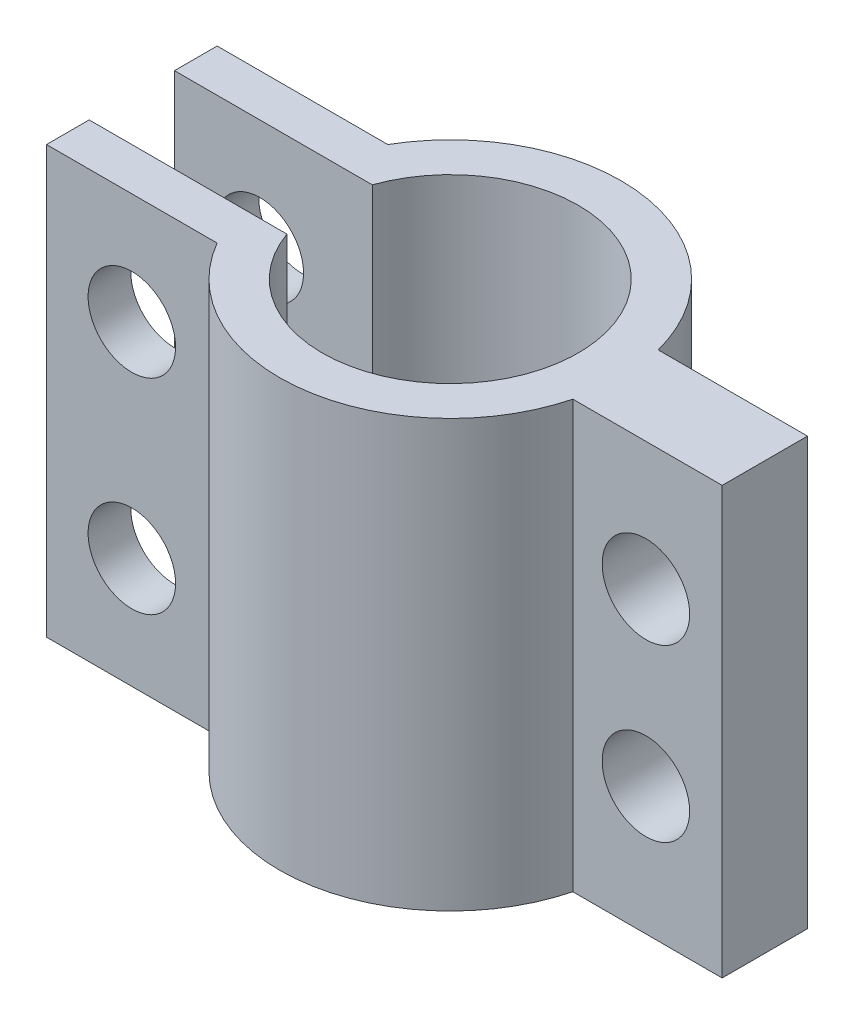
ISO-10303-21;
HEADER;
FILE_DESCRIPTION(('STEP AP214'),'2;1');
FILE_NAME('part.step','',(''),(''),'','','');
FILE_SCHEMA(('AUTOMOTIVE_DESIGN { 1 0 10303 214 1 1 1 1 }'));
ENDSEC;
DATA;
#1=APPLICATION_CONTEXT('core data for automotive mechanical design processes');
#2=APPLICATION_PROTOCOL_DEFINITION('international standard','automotive_design',2000,#1);
#3=PRODUCT_CONTEXT('',#1,'mechanical');
#4=PRODUCT('Part','Part','',(#3));
#5=PRODUCT_RELATED_PRODUCT_CATEGORY('part','',(#4));
#6=PRODUCT_DEFINITION_FORMATION('','',#4);
#7=PRODUCT_DEFINITION_CONTEXT('part definition',#1,'design');
#8=PRODUCT_DEFINITION('design','',#6,#7);
#9=PRODUCT_DEFINITION_SHAPE('','',#8);
#10=(LENGTH_UNIT() NAMED_UNIT(*) SI_UNIT(.MILLI.,.METRE.));
#11=(NAMED_UNIT(*) PLANE_ANGLE_UNIT() SI_UNIT($,.RADIAN.));
#12=(NAMED_UNIT(*) SI_UNIT($,.STERADIAN.) SOLID_ANGLE_UNIT());
#13=UNCERTAINTY_MEASURE_WITH_UNIT(LENGTH_MEASURE(1.E-05),#10,'distance_accuracy_value','');
#14=(GEOMETRIC_REPRESENTATION_CONTEXT(3) GLOBAL_UNCERTAINTY_ASSIGNED_CONTEXT((#13)) GLOBAL_UNIT_ASSIGNED_CONTEXT((#10,
#11,#12)) REPRESENTATION_CONTEXT('',''));
#15=CARTESIAN_POINT('',(0.,0.,0.));
#16=DIRECTION('',(0.,0.,1.));
#17=DIRECTION('',(1.,0.,0.));
#18=AXIS2_PLACEMENT_3D('',#15,#16,#17);
#19=CARTESIAN_POINT('',(0.,20.,-2.));
#20=DIRECTION('',(0.,0.,-1.));
#21=DIRECTION('',(-1.,0.,0.));
#22=AXIS2_PLACEMENT_3D('',#19,#20,#21);
#23=PLANE('',#22);
#24=CARTESIAN_POINT('',(11.1706582066653,14.,-2.));
#25=DIRECTION('',(0.,0.,-1.));
#26=DIRECTION('',(-1.,0.,0.));
#27=AXIS2_PLACEMENT_3D('',#24,#25,#26);
#28=CIRCLE('',#27,2.05);
#29=CARTESIAN_POINT('',(9.12065820666526,14.,-2.));
#30=VERTEX_POINT('',#29);
#31=EDGE_CURVE('E185',#30,#30,#28,.T.);
#32=ORIENTED_EDGE('',*,*,#31,.F.);
#33=EDGE_LOOP('',(#32));
#34=FACE_BOUND('',#33,.T.);
#35=CARTESIAN_POINT('',(11.1706582066653,6.,-2.));
#36=DIRECTION('',(0.,0.,-1.));
#37=DIRECTION('',(-1.,0.,0.));
#38=AXIS2_PLACEMENT_3D('',#35,#36,#37);
#39=CIRCLE('',#38,2.05);
#40=CARTESIAN_POINT('',(9.12065820666526,6.,-2.));
#41=VERTEX_POINT('',#40);
#42=EDGE_CURVE('E226',#41,#41,#39,.T.);
#43=ORIENTED_EDGE('',*,*,#42,.F.);
#44=EDGE_LOOP('',(#43));
#45=FACE_BOUND('',#44,.T.);
#46=DIRECTION('',(1.,0.,0.));
#47=VECTOR('',#46,1.);
#48=CARTESIAN_POINT('',(0.,0.,-2.));
#49=LINE('',#48,#47);
#50=CARTESIAN_POINT('',(7.74596669241483,0.,-2.));
#51=VERTEX_POINT('',#50);
#52=CARTESIAN_POINT('',(14.7459666924148,0.,-2.));
#53=VERTEX_POINT('',#52);
#54=EDGE_CURVE('E176',#51,#53,#49,.T.);
#55=ORIENTED_EDGE('',*,*,#54,.F.);
#56=DIRECTION('',(0.,-1.,0.));
#57=VECTOR('',#56,1.);
#58=CARTESIAN_POINT('',(7.74596669241483,20.,-2.));
#59=LINE('',#58,#57);
#60=CARTESIAN_POINT('',(7.74596669241483,20.,-2.));
#61=VERTEX_POINT('',#60);
#62=EDGE_CURVE('E12',#61,#51,#59,.T.);
#63=ORIENTED_EDGE('',*,*,#62,.F.);
#64=DIRECTION('',(1.,0.,0.));
#65=VECTOR('',#64,1.);
#66=CARTESIAN_POINT('',(0.,20.,-2.));
#67=LINE('',#66,#65);
#68=CARTESIAN_POINT('',(14.7459666924148,20.,-2.));
#69=VERTEX_POINT('',#68);
#70=EDGE_CURVE('E242',#61,#69,#67,.T.);
#71=ORIENTED_EDGE('',*,*,#70,.T.);
#72=DIRECTION('',(0.,-1.,0.));
#73=VECTOR('',#72,1.);
#74=CARTESIAN_POINT('',(14.7459666924148,20.,-2.));
#75=LINE('',#74,#73);
#76=EDGE_CURVE('E96',#69,#53,#75,.T.);
#77=ORIENTED_EDGE('',*,*,#76,.T.);
#78=EDGE_LOOP('',(#55,#63,#71,#77));
#79=FACE_BOUND('',#78,.T.);
#80=ADVANCED_FACE('F77',(#34,#45,#79),#23,.T.);
#81=CARTESIAN_POINT('',(0.,20.,2.));
#82=DIRECTION('',(0.,0.,1.));
#83=DIRECTION('',(1.,0.,0.));
#84=AXIS2_PLACEMENT_3D('',#81,#82,#83);
#85=PLANE('',#84);
#86=CARTESIAN_POINT('',(11.1706582066653,14.,2.));
#87=DIRECTION('',(0.,0.,1.));
#88=DIRECTION('',(1.,0.,0.));
#89=AXIS2_PLACEMENT_3D('',#86,#87,#88);
#90=CIRCLE('',#89,2.05);
#91=CARTESIAN_POINT('',(13.2206582066653,14.,2.));
#92=VERTEX_POINT('',#91);
#93=EDGE_CURVE('E81',#92,#92,#90,.T.);
#94=ORIENTED_EDGE('',*,*,#93,.F.);
#95=EDGE_LOOP('',(#94));
#96=FACE_BOUND('',#95,.T.);
#97=CARTESIAN_POINT('',(11.1706582066653,6.,2.));
#98=DIRECTION('',(0.,0.,1.));
#99=DIRECTION('',(1.,0.,0.));
#100=AXIS2_PLACEMENT_3D('',#97,#98,#99);
#101=CIRCLE('',#100,2.05);
#102=CARTESIAN_POINT('',(13.2206582066653,6.,2.));
#103=VERTEX_POINT('',#102);
#104=EDGE_CURVE('E224',#103,#103,#101,.T.);
#105=ORIENTED_EDGE('',*,*,#104,.F.);
#106=EDGE_LOOP('',(#105));
#107=FACE_BOUND('',#106,.T.);
#108=DIRECTION('',(-1.,0.,0.));
#109=VECTOR('',#108,1.);
#110=CARTESIAN_POINT('',(0.,0.,2.));
#111=LINE('',#110,#109);
#112=CARTESIAN_POINT('',(14.7459666924148,0.,2.));
#113=VERTEX_POINT('',#112);
#114=CARTESIAN_POINT('',(7.74596669241483,0.,2.));
#115=VERTEX_POINT('',#114);
#116=EDGE_CURVE('E251',#113,#115,#111,.T.);
#117=ORIENTED_EDGE('',*,*,#116,.F.);
#118=DIRECTION('',(0.,-1.,0.));
#119=VECTOR('',#118,1.);
#120=CARTESIAN_POINT('',(14.7459666924148,20.,2.));
#121=LINE('',#120,#119);
#122=CARTESIAN_POINT('',(14.7459666924148,20.,2.));
#123=VERTEX_POINT('',#122);
#124=EDGE_CURVE('E257',#123,#113,#121,.T.);
#125=ORIENTED_EDGE('',*,*,#124,.F.);
#126=DIRECTION('',(-1.,0.,0.));
#127=VECTOR('',#126,1.);
#128=CARTESIAN_POINT('',(0.,20.,2.));
#129=LINE('',#128,#127);
#130=CARTESIAN_POINT('',(7.74596669241483,20.,2.));
#131=VERTEX_POINT('',#130);
#132=EDGE_CURVE('E244',#123,#131,#129,.T.);
#133=ORIENTED_EDGE('',*,*,#132,.T.);
#134=DIRECTION('',(0.,-1.,0.));
#135=VECTOR('',#134,1.);
#136=CARTESIAN_POINT('',(7.74596669241483,20.,2.));
#137=LINE('',#136,#135);
#138=EDGE_CURVE('E87',#131,#115,#137,.T.);
#139=ORIENTED_EDGE('',*,*,#138,.T.);
#140=EDGE_LOOP('',(#117,#125,#133,#139));
#141=FACE_BOUND('',#140,.T.);
#142=ADVANCED_FACE('F387',(#96,#107,#141),#85,.T.);
#143=CARTESIAN_POINT('',(14.7459666924148,20.,0.));
#144=DIRECTION('',(1.,0.,0.));
#145=DIRECTION('',(0.,0.,-1.));
#146=AXIS2_PLACEMENT_3D('',#143,#144,#145);
#147=PLANE('',#146);
#148=DIRECTION('',(0.,0.,1.));
#149=VECTOR('',#148,1.);
#150=CARTESIAN_POINT('',(14.7459666924148,0.,0.));
#151=LINE('',#150,#149);
#152=EDGE_CURVE('E245',#53,#113,#151,.T.);
#153=ORIENTED_EDGE('',*,*,#152,.F.);
#154=ORIENTED_EDGE('',*,*,#76,.F.);
#155=DIRECTION('',(0.,0.,1.));
#156=VECTOR('',#155,1.);
#157=CARTESIAN_POINT('',(14.7459666924148,20.,0.));
#158=LINE('',#157,#156);
#159=EDGE_CURVE('E248',#69,#123,#158,.T.);
#160=ORIENTED_EDGE('',*,*,#159,.T.);
#161=ORIENTED_EDGE('',*,*,#124,.T.);
#162=EDGE_LOOP('',(#153,#154,#160,#161));
#163=FACE_BOUND('',#162,.T.);
#164=ADVANCED_FACE('F383',(#163),#147,.T.);
#165=CARTESIAN_POINT('',(0.,20.,0.));
#166=DIRECTION('',(0.,1.,0.));
#167=DIRECTION('',(0.,0.,1.));
#168=AXIS2_PLACEMENT_3D('',#165,#166,#167);
#169=PLANE('',#168);
#170=ORIENTED_EDGE('',*,*,#70,.F.);
#171=CARTESIAN_POINT('',(0.,20.,0.));
#172=DIRECTION('',(0.,-1.,0.));
#173=DIRECTION('',(0.,0.,-1.));
#174=AXIS2_PLACEMENT_3D('',#171,#172,#173);
#175=CIRCLE('',#174,8.);
#176=CARTESIAN_POINT('',(-6.92820323027551,20.,-4.));
#177=VERTEX_POINT('',#176);
#178=EDGE_CURVE('E260',#177,#61,#175,.T.);
#179=ORIENTED_EDGE('',*,*,#178,.F.);
#180=DIRECTION('',(1.,0.,0.));
#181=VECTOR('',#180,1.);
#182=CARTESIAN_POINT('',(-14.9282032302755,20.,-4.));
#183=LINE('',#182,#181);
#184=CARTESIAN_POINT('',(-14.9282032302755,20.,-4.));
#185=VERTEX_POINT('',#184);
#186=EDGE_CURVE('E191',#185,#177,#183,.T.);
#187=ORIENTED_EDGE('',*,*,#186,.F.);
#188=DIRECTION('',(0.,0.,-1.));
#189=VECTOR('',#188,1.);
#190=CARTESIAN_POINT('',(-14.9282032302755,20.,-2.));
#191=LINE('',#190,#189);
#192=CARTESIAN_POINT('',(-14.9282032302755,20.,-2.));
#193=VERTEX_POINT('',#192);
#194=EDGE_CURVE('E172',#193,#185,#191,.T.);
#195=ORIENTED_EDGE('',*,*,#194,.F.);
#196=DIRECTION('',(-1.,0.,0.));
#197=VECTOR('',#196,1.);
#198=CARTESIAN_POINT('',(-5.65685424949238,20.,-2.));
#199=LINE('',#198,#197);
#200=CARTESIAN_POINT('',(-5.65685424949238,20.,-2.));
#201=VERTEX_POINT('',#200);
#202=EDGE_CURVE('E272',#201,#193,#199,.T.);
#203=ORIENTED_EDGE('',*,*,#202,.F.);
#204=CARTESIAN_POINT('',(0.,20.,0.));
#205=DIRECTION('',(0.,-1.,0.));
#206=DIRECTION('',(0.,0.,-1.));
#207=AXIS2_PLACEMENT_3D('',#204,#205,#206);
#208=CIRCLE('',#207,6.);
#209=CARTESIAN_POINT('',(-5.65685424949238,20.,2.));
#210=VERTEX_POINT('',#209);
#211=EDGE_CURVE('E270',#201,#210,#208,.T.);
#212=ORIENTED_EDGE('',*,*,#211,.T.);
#213=DIRECTION('',(-1.,0.,0.));
#214=VECTOR('',#213,1.);
#215=CARTESIAN_POINT('',(-5.65685424949238,20.,2.));
#216=LINE('',#215,#214);
#217=CARTESIAN_POINT('',(-14.9282032302755,20.,2.));
#218=VERTEX_POINT('',#217);
#219=EDGE_CURVE('E268',#210,#218,#216,.T.);
#220=ORIENTED_EDGE('',*,*,#219,.T.);
#221=DIRECTION('',(0.,0.,1.));
#222=VECTOR('',#221,1.);
#223=CARTESIAN_POINT('',(-14.9282032302755,20.,2.));
#224=LINE('',#223,#222);
#225=CARTESIAN_POINT('',(-14.9282032302755,20.,4.));
#226=VERTEX_POINT('',#225);
#227=EDGE_CURVE('E266',#218,#226,#224,.T.);
#228=ORIENTED_EDGE('',*,*,#227,.T.);
#229=DIRECTION('',(1.,0.,0.));
#230=VECTOR('',#229,1.);
#231=CARTESIAN_POINT('',(-14.9282032302755,20.,4.));
#232=LINE('',#231,#230);
#233=CARTESIAN_POINT('',(-6.9282032302755,20.,4.00000000000001));
#234=VERTEX_POINT('',#233);
#235=EDGE_CURVE('E263',#226,#234,#232,.T.);
#236=ORIENTED_EDGE('',*,*,#235,.T.);
#237=EDGE_CURVE('E193',#131,#234,#175,.T.);
#238=ORIENTED_EDGE('',*,*,#237,.F.);
#239=ORIENTED_EDGE('',*,*,#132,.F.);
#240=ORIENTED_EDGE('',*,*,#159,.F.);
#241=EDGE_LOOP('',(#170,#179,#187,#195,#203,#212,#220,#228,#236,#238,#239,#240));
#242=FACE_BOUND('',#241,.T.);
#243=ADVANCED_FACE('F305',(#242),#169,.T.);
#244=CARTESIAN_POINT('',(0.,0.,0.));
#245=DIRECTION('',(0.,1.,0.));
#246=DIRECTION('',(0.,0.,1.));
#247=AXIS2_PLACEMENT_3D('',#244,#245,#246);
#248=PLANE('',#247);
#249=ORIENTED_EDGE('',*,*,#54,.T.);
#250=ORIENTED_EDGE('',*,*,#152,.T.);
#251=ORIENTED_EDGE('',*,*,#116,.T.);
#252=CARTESIAN_POINT('',(0.,0.,0.));
#253=DIRECTION('',(0.,-1.,0.));
#254=DIRECTION('',(0.,0.,-1.));
#255=AXIS2_PLACEMENT_3D('',#252,#253,#254);
#256=CIRCLE('',#255,8.);
#257=CARTESIAN_POINT('',(-6.9282032302755,0.,4.00000000000001));
#258=VERTEX_POINT('',#257);
#259=EDGE_CURVE('E184',#115,#258,#256,.T.);
#260=ORIENTED_EDGE('',*,*,#259,.T.);
#261=DIRECTION('',(1.,0.,0.));
#262=VECTOR('',#261,1.);
#263=CARTESIAN_POINT('',(-14.9282032302755,0.,4.));
#264=LINE('',#263,#262);
#265=CARTESIAN_POINT('',(-14.9282032302755,0.,4.));
#266=VERTEX_POINT('',#265);
#267=EDGE_CURVE('E277',#266,#258,#264,.T.);
#268=ORIENTED_EDGE('',*,*,#267,.F.);
#269=DIRECTION('',(0.,0.,1.));
#270=VECTOR('',#269,1.);
#271=CARTESIAN_POINT('',(-14.9282032302755,0.,2.));
#272=LINE('',#271,#270);
#273=CARTESIAN_POINT('',(-14.9282032302755,0.,2.));
#274=VERTEX_POINT('',#273);
#275=EDGE_CURVE('E280',#274,#266,#272,.T.);
#276=ORIENTED_EDGE('',*,*,#275,.F.);
#277=DIRECTION('',(-1.,0.,0.));
#278=VECTOR('',#277,1.);
#279=CARTESIAN_POINT('',(-5.65685424949238,0.,2.));
#280=LINE('',#279,#278);
#281=CARTESIAN_POINT('',(-5.65685424949238,0.,2.));
#282=VERTEX_POINT('',#281);
#283=EDGE_CURVE('E282',#282,#274,#280,.T.);
#284=ORIENTED_EDGE('',*,*,#283,.F.);
#285=CARTESIAN_POINT('',(0.,0.,0.));
#286=DIRECTION('',(0.,-1.,0.));
#287=DIRECTION('',(0.,0.,-1.));
#288=AXIS2_PLACEMENT_3D('',#285,#286,#287);
#289=CIRCLE('',#288,6.);
#290=CARTESIAN_POINT('',(-5.65685424949238,0.,-2.));
#291=VERTEX_POINT('',#290);
#292=EDGE_CURVE('E195',#291,#282,#289,.T.);
#293=ORIENTED_EDGE('',*,*,#292,.F.);
#294=DIRECTION('',(-1.,0.,0.));
#295=VECTOR('',#294,1.);
#296=CARTESIAN_POINT('',(-5.65685424949238,0.,-2.));
#297=LINE('',#296,#295);
#298=CARTESIAN_POINT('',(-14.9282032302755,0.,-2.));
#299=VERTEX_POINT('',#298);
#300=EDGE_CURVE('E190',#291,#299,#297,.T.);
#301=ORIENTED_EDGE('',*,*,#300,.T.);
#302=DIRECTION('',(0.,0.,-1.));
#303=VECTOR('',#302,1.);
#304=CARTESIAN_POINT('',(-14.9282032302755,0.,-2.));
#305=LINE('',#304,#303);
#306=CARTESIAN_POINT('',(-14.9282032302755,0.,-4.));
#307=VERTEX_POINT('',#306);
#308=EDGE_CURVE('E170',#299,#307,#305,.T.);
#309=ORIENTED_EDGE('',*,*,#308,.T.);
#310=DIRECTION('',(1.,0.,0.));
#311=VECTOR('',#310,1.);
#312=CARTESIAN_POINT('',(-14.9282032302755,0.,-4.));
#313=LINE('',#312,#311);
#314=CARTESIAN_POINT('',(-6.92820323027551,0.,-4.));
#315=VERTEX_POINT('',#314);
#316=EDGE_CURVE('E179',#307,#315,#313,.T.);
#317=ORIENTED_EDGE('',*,*,#316,.T.);
#318=EDGE_CURVE('E275',#315,#51,#256,.T.);
#319=ORIENTED_EDGE('',*,*,#318,.T.);
#320=EDGE_LOOP('',(#249,#250,#251,#260,#268,#276,#284,#293,#301,#309,#317,#319));
#321=FACE_BOUND('',#320,.T.);
#322=ADVANCED_FACE('F188',(#321),#248,.F.);
#323=CARTESIAN_POINT('',(-14.9282032302755,20.,-2.));
#324=DIRECTION('',(-1.,0.,0.));
#325=DIRECTION('',(0.,0.,1.));
#326=AXIS2_PLACEMENT_3D('',#323,#324,#325);
#327=PLANE('',#326);
#328=ORIENTED_EDGE('',*,*,#308,.F.);
#329=DIRECTION('',(0.,-1.,0.));
#330=VECTOR('',#329,1.);
#331=CARTESIAN_POINT('',(-14.9282032302755,20.,-2.));
#332=LINE('',#331,#330);
#333=EDGE_CURVE('E160',#193,#299,#332,.T.);
#334=ORIENTED_EDGE('',*,*,#333,.F.);
#335=ORIENTED_EDGE('',*,*,#194,.T.);
#336=DIRECTION('',(0.,-1.,0.));
#337=VECTOR('',#336,1.);
#338=CARTESIAN_POINT('',(-14.9282032302755,20.,-4.));
#339=LINE('',#338,#337);
#340=EDGE_CURVE('E166',#185,#307,#339,.T.);
#341=ORIENTED_EDGE('',*,*,#340,.T.);
#342=EDGE_LOOP('',(#328,#334,#335,#341));
#343=FACE_BOUND('',#342,.T.);
#344=ADVANCED_FACE('F168',(#343),#327,.T.);
#345=CARTESIAN_POINT('',(-5.65685424949238,20.,-2.));
#346=DIRECTION('',(0.,0.,1.));
#347=DIRECTION('',(1.,0.,0.));
#348=AXIS2_PLACEMENT_3D('',#345,#346,#347);
#349=PLANE('',#348);
#350=CARTESIAN_POINT('',(-10.9282032302755,5.2,-2.));
#351=DIRECTION('',(0.,0.,1.));
#352=DIRECTION('',(1.,0.,0.));
#353=AXIS2_PLACEMENT_3D('',#350,#351,#352);
#354=CIRCLE('',#353,2.05);
#355=CARTESIAN_POINT('',(-8.8782032302755,5.2,-2.));
#356=VERTEX_POINT('',#355);
#357=EDGE_CURVE('E227',#356,#356,#354,.T.);
#358=ORIENTED_EDGE('',*,*,#357,.F.);
#359=EDGE_LOOP('',(#358));
#360=FACE_BOUND('',#359,.T.);
#361=CARTESIAN_POINT('',(-10.9282032302755,14.8,-2.));
#362=DIRECTION('',(0.,0.,1.));
#363=DIRECTION('',(1.,0.,0.));
#364=AXIS2_PLACEMENT_3D('',#361,#362,#363);
#365=CIRCLE('',#364,2.05);
#366=CARTESIAN_POINT('',(-8.8782032302755,14.8,-2.));
#367=VERTEX_POINT('',#366);
#368=EDGE_CURVE('E223',#367,#367,#365,.T.);
#369=ORIENTED_EDGE('',*,*,#368,.F.);
#370=EDGE_LOOP('',(#369));
#371=FACE_BOUND('',#370,.T.);
#372=ORIENTED_EDGE('',*,*,#300,.F.);
#373=DIRECTION('',(0.,-1.,0.));
#374=VECTOR('',#373,1.);
#375=CARTESIAN_POINT('',(-5.65685424949238,20.,-2.));
#376=LINE('',#375,#374);
#377=EDGE_CURVE('E200',#201,#291,#376,.T.);
#378=ORIENTED_EDGE('',*,*,#377,.F.);
#379=ORIENTED_EDGE('',*,*,#202,.T.);
#380=ORIENTED_EDGE('',*,*,#333,.T.);
#381=EDGE_LOOP('',(#372,#378,#379,#380));
#382=FACE_BOUND('',#381,.T.);
#383=ADVANCED_FACE('F308',(#360,#371,#382),#349,.T.);
#384=CARTESIAN_POINT('',(0.,20.,0.));
#385=DIRECTION('',(0.,-1.,0.));
#386=DIRECTION('',(0.,0.,-1.));
#387=AXIS2_PLACEMENT_3D('',#384,#385,#386);
#388=CYLINDRICAL_SURFACE('',#387,6.);
#389=ORIENTED_EDGE('',*,*,#292,.T.);
#390=DIRECTION('',(0.,-1.,0.));
#391=VECTOR('',#390,1.);
#392=CARTESIAN_POINT('',(-5.65685424949238,20.,2.));
#393=LINE('',#392,#391);
#394=EDGE_CURVE('E202',#210,#282,#393,.T.);
#395=ORIENTED_EDGE('',*,*,#394,.F.);
#396=ORIENTED_EDGE('',*,*,#211,.F.);
#397=ORIENTED_EDGE('',*,*,#377,.T.);
#398=EDGE_LOOP('',(#389,#395,#396,#397));
#399=FACE_BOUND('',#398,.T.);
#400=ADVANCED_FACE('F285',(#399),#388,.F.);
#401=CARTESIAN_POINT('',(-5.65685424949238,20.,2.));
#402=DIRECTION('',(0.,0.,1.));
#403=DIRECTION('',(1.,0.,0.));
#404=AXIS2_PLACEMENT_3D('',#401,#402,#403);
#405=PLANE('',#404);
#406=CARTESIAN_POINT('',(-10.9282032302755,5.2,2.));
#407=DIRECTION('',(0.,0.,1.));
#408=DIRECTION('',(1.,0.,0.));
#409=AXIS2_PLACEMENT_3D('',#406,#407,#408);
#410=CIRCLE('',#409,2.05);
#411=CARTESIAN_POINT('',(-8.8782032302755,5.2,2.));
#412=VERTEX_POINT('',#411);
#413=EDGE_CURVE('E222',#412,#412,#410,.T.);
#414=ORIENTED_EDGE('',*,*,#413,.T.);
#415=EDGE_LOOP('',(#414));
#416=FACE_BOUND('',#415,.T.);
#417=CARTESIAN_POINT('',(-10.9282032302755,14.8,2.));
#418=DIRECTION('',(0.,0.,1.));
#419=DIRECTION('',(1.,0.,0.));
#420=AXIS2_PLACEMENT_3D('',#417,#418,#419);
#421=CIRCLE('',#420,2.05);
#422=CARTESIAN_POINT('',(-8.8782032302755,14.8,2.));
#423=VERTEX_POINT('',#422);
#424=EDGE_CURVE('E218',#423,#423,#421,.T.);
#425=ORIENTED_EDGE('',*,*,#424,.T.);
#426=EDGE_LOOP('',(#425));
#427=FACE_BOUND('',#426,.T.);
#428=ORIENTED_EDGE('',*,*,#283,.T.);
#429=DIRECTION('',(0.,-1.,0.));
#430=VECTOR('',#429,1.);
#431=CARTESIAN_POINT('',(-14.9282032302755,20.,2.));
#432=LINE('',#431,#430);
#433=EDGE_CURVE('E205',#218,#274,#432,.T.);
#434=ORIENTED_EDGE('',*,*,#433,.F.);
#435=ORIENTED_EDGE('',*,*,#219,.F.);
#436=ORIENTED_EDGE('',*,*,#394,.T.);
#437=EDGE_LOOP('',(#428,#434,#435,#436));
#438=FACE_BOUND('',#437,.T.);
#439=ADVANCED_FACE('F290',(#416,#427,#438),#405,.F.);
#440=CARTESIAN_POINT('',(-14.9282032302755,20.,2.));
#441=DIRECTION('',(1.,0.,0.));
#442=DIRECTION('',(0.,0.,-1.));
#443=AXIS2_PLACEMENT_3D('',#440,#441,#442);
#444=PLANE('',#443);
#445=ORIENTED_EDGE('',*,*,#275,.T.);
#446=DIRECTION('',(0.,-1.,0.));
#447=VECTOR('',#446,1.);
#448=CARTESIAN_POINT('',(-14.9282032302755,20.,4.));
#449=LINE('',#448,#447);
#450=EDGE_CURVE('E208',#226,#266,#449,.T.);
#451=ORIENTED_EDGE('',*,*,#450,.F.);
#452=ORIENTED_EDGE('',*,*,#227,.F.);
#453=ORIENTED_EDGE('',*,*,#433,.T.);
#454=EDGE_LOOP('',(#445,#451,#452,#453));
#455=FACE_BOUND('',#454,.T.);
#456=ADVANCED_FACE('F296',(#455),#444,.F.);
#457=CARTESIAN_POINT('',(-14.9282032302755,20.,4.));
#458=DIRECTION('',(0.,0.,-1.));
#459=DIRECTION('',(-1.,0.,0.));
#460=AXIS2_PLACEMENT_3D('',#457,#458,#459);
#461=PLANE('',#460);
#462=CARTESIAN_POINT('',(-10.9282032302755,5.2,4.));
#463=DIRECTION('',(0.,0.,1.));
#464=DIRECTION('',(1.,0.,0.));
#465=AXIS2_PLACEMENT_3D('',#462,#463,#464);
#466=CIRCLE('',#465,2.05);
#467=CARTESIAN_POINT('',(-8.8782032302755,5.2,4.));
#468=VERTEX_POINT('',#467);
#469=EDGE_CURVE('E352',#468,#468,#466,.T.);
#470=ORIENTED_EDGE('',*,*,#469,.F.);
#471=EDGE_LOOP('',(#470));
#472=FACE_BOUND('',#471,.T.);
#473=CARTESIAN_POINT('',(-10.9282032302755,14.8,4.));
#474=DIRECTION('',(0.,0.,1.));
#475=DIRECTION('',(1.,0.,0.));
#476=AXIS2_PLACEMENT_3D('',#473,#474,#475);
#477=CIRCLE('',#476,2.05);
#478=CARTESIAN_POINT('',(-8.8782032302755,14.8,4.));
#479=VERTEX_POINT('',#478);
#480=EDGE_CURVE('E219',#479,#479,#477,.T.);
#481=ORIENTED_EDGE('',*,*,#480,.F.);
#482=EDGE_LOOP('',(#481));
#483=FACE_BOUND('',#482,.T.);
#484=ORIENTED_EDGE('',*,*,#267,.T.);
#485=DIRECTION('',(0.,-1.,0.));
#486=VECTOR('',#485,1.);
#487=CARTESIAN_POINT('',(-6.9282032302755,20.,4.00000000000001));
#488=LINE('',#487,#486);
#489=EDGE_CURVE('E211',#234,#258,#488,.T.);
#490=ORIENTED_EDGE('',*,*,#489,.F.);
#491=ORIENTED_EDGE('',*,*,#235,.F.);
#492=ORIENTED_EDGE('',*,*,#450,.T.);
#493=EDGE_LOOP('',(#484,#490,#491,#492));
#494=FACE_BOUND('',#493,.T.);
#495=ADVANCED_FACE('F300',(#472,#483,#494),#461,.F.);
#496=CARTESIAN_POINT('',(0.,20.,0.));
#497=DIRECTION('',(0.,-1.,0.));
#498=DIRECTION('',(0.,0.,-1.));
#499=AXIS2_PLACEMENT_3D('',#496,#497,#498);
#500=CYLINDRICAL_SURFACE('',#499,8.);
#501=ORIENTED_EDGE('',*,*,#259,.F.);
#502=ORIENTED_EDGE('',*,*,#138,.F.);
#503=ORIENTED_EDGE('',*,*,#237,.T.);
#504=ORIENTED_EDGE('',*,*,#489,.T.);
#505=EDGE_LOOP('',(#501,#502,#503,#504));
#506=FACE_BOUND('',#505,.T.);
#507=ADVANCED_FACE('F323',(#506),#500,.T.);
#508=ORIENTED_EDGE('',*,*,#178,.T.);
#509=ORIENTED_EDGE('',*,*,#62,.T.);
#510=ORIENTED_EDGE('',*,*,#318,.F.);
#511=DIRECTION('',(0.,-1.,0.));
#512=VECTOR('',#511,1.);
#513=CARTESIAN_POINT('',(-6.92820323027551,20.,-4.));
#514=LINE('',#513,#512);
#515=EDGE_CURVE('E180',#177,#315,#514,.T.);
#516=ORIENTED_EDGE('',*,*,#515,.F.);
#517=EDGE_LOOP('',(#508,#509,#510,#516));
#518=FACE_BOUND('',#517,.T.);
#519=ADVANCED_FACE('F321',(#518),#500,.T.);
#520=CARTESIAN_POINT('',(-14.9282032302755,20.,-4.));
#521=DIRECTION('',(0.,0.,-1.));
#522=DIRECTION('',(-1.,0.,0.));
#523=AXIS2_PLACEMENT_3D('',#520,#521,#522);
#524=PLANE('',#523);
#525=CARTESIAN_POINT('',(-10.9282032302755,5.2,-4.));
#526=DIRECTION('',(0.,0.,-1.));
#527=DIRECTION('',(-1.,0.,0.));
#528=AXIS2_PLACEMENT_3D('',#525,#526,#527);
#529=CIRCLE('',#528,2.05);
#530=CARTESIAN_POINT('',(-12.9782032302755,5.2,-4.));
#531=VERTEX_POINT('',#530);
#532=EDGE_CURVE('E220',#531,#531,#529,.T.);
#533=ORIENTED_EDGE('',*,*,#532,.F.);
#534=EDGE_LOOP('',(#533));
#535=FACE_BOUND('',#534,.T.);
#536=CARTESIAN_POINT('',(-10.9282032302755,14.8,-4.));
#537=DIRECTION('',(0.,0.,-1.));
#538=DIRECTION('',(-1.,0.,0.));
#539=AXIS2_PLACEMENT_3D('',#536,#537,#538);
#540=CIRCLE('',#539,2.05);
#541=CARTESIAN_POINT('',(-12.9782032302755,14.8,-4.));
#542=VERTEX_POINT('',#541);
#543=EDGE_CURVE('E215',#542,#542,#540,.T.);
#544=ORIENTED_EDGE('',*,*,#543,.F.);
#545=EDGE_LOOP('',(#544));
#546=FACE_BOUND('',#545,.T.);
#547=ORIENTED_EDGE('',*,*,#316,.F.);
#548=ORIENTED_EDGE('',*,*,#340,.F.);
#549=ORIENTED_EDGE('',*,*,#186,.T.);
#550=ORIENTED_EDGE('',*,*,#515,.T.);
#551=EDGE_LOOP('',(#547,#548,#549,#550));
#552=FACE_BOUND('',#551,.T.);
#553=ADVANCED_FACE('F79',(#535,#546,#552),#524,.T.);
#554=CARTESIAN_POINT('',(-10.9282032302755,14.8,-16.));
#555=DIRECTION('',(0.,0.,1.));
#556=DIRECTION('',(1.,0.,0.));
#557=AXIS2_PLACEMENT_3D('',#554,#555,#556);
#558=CYLINDRICAL_SURFACE('',#557,2.05);
#559=ORIENTED_EDGE('',*,*,#368,.T.);
#560=EDGE_LOOP('',(#559));
#561=FACE_BOUND('',#560,.T.);
#562=ORIENTED_EDGE('',*,*,#543,.T.);
#563=EDGE_LOOP('',(#562));
#564=FACE_BOUND('',#563,.T.);
#565=ADVANCED_FACE('F330',(#561,#564),#558,.F.);
#566=CARTESIAN_POINT('',(-10.9282032302755,5.2,-16.));
#567=DIRECTION('',(0.,0.,1.));
#568=DIRECTION('',(1.,0.,0.));
#569=AXIS2_PLACEMENT_3D('',#566,#567,#568);
#570=CYLINDRICAL_SURFACE('',#569,2.05);
#571=ORIENTED_EDGE('',*,*,#357,.T.);
#572=EDGE_LOOP('',(#571));
#573=FACE_BOUND('',#572,.T.);
#574=ORIENTED_EDGE('',*,*,#532,.T.);
#575=EDGE_LOOP('',(#574));
#576=FACE_BOUND('',#575,.T.);
#577=ADVANCED_FACE('F363',(#573,#576),#570,.F.);
#578=ORIENTED_EDGE('',*,*,#480,.T.);
#579=EDGE_LOOP('',(#578));
#580=FACE_BOUND('',#579,.T.);
#581=ORIENTED_EDGE('',*,*,#424,.F.);
#582=EDGE_LOOP('',(#581));
#583=FACE_BOUND('',#582,.T.);
#584=ADVANCED_FACE('F361',(#580,#583),#558,.F.);
#585=ORIENTED_EDGE('',*,*,#469,.T.);
#586=EDGE_LOOP('',(#585));
#587=FACE_BOUND('',#586,.T.);
#588=ORIENTED_EDGE('',*,*,#413,.F.);
#589=EDGE_LOOP('',(#588));
#590=FACE_BOUND('',#589,.T.);
#591=ADVANCED_FACE('F356',(#587,#590),#570,.F.);
#592=CARTESIAN_POINT('',(11.1706582066653,6.,-16.));
#593=DIRECTION('',(0.,0.,1.));
#594=DIRECTION('',(1.,0.,0.));
#595=AXIS2_PLACEMENT_3D('',#592,#593,#594);
#596=CYLINDRICAL_SURFACE('',#595,2.05);
#597=ORIENTED_EDGE('',*,*,#42,.T.);
#598=EDGE_LOOP('',(#597));
#599=FACE_BOUND('',#598,.T.);
#600=ORIENTED_EDGE('',*,*,#104,.T.);
#601=EDGE_LOOP('',(#600));
#602=FACE_BOUND('',#601,.T.);
#603=ADVANCED_FACE('F369',(#599,#602),#596,.F.);
#604=CARTESIAN_POINT('',(11.1706582066653,14.,-16.));
#605=DIRECTION('',(0.,0.,1.));
#606=DIRECTION('',(1.,0.,0.));
#607=AXIS2_PLACEMENT_3D('',#604,#605,#606);
#608=CYLINDRICAL_SURFACE('',#607,2.05);
#609=ORIENTED_EDGE('',*,*,#31,.T.);
#610=EDGE_LOOP('',(#609));
#611=FACE_BOUND('',#610,.T.);
#612=ORIENTED_EDGE('',*,*,#93,.T.);
#613=EDGE_LOOP('',(#612));
#614=FACE_BOUND('',#613,.T.);
#615=ADVANCED_FACE('F408',(#611,#614),#608,.F.);
#616=CLOSED_SHELL('',(#80,#142,#164,#243,#322,#344,#383,#400,#439,#456,#495,#507,#519,#553,#565,
#577,#584,#591,#603,#615));
#617=MANIFOLD_SOLID_BREP('B2',#616);
#618=ADVANCED_BREP_SHAPE_REPRESENTATION('',(#18,#617),#14);
#619=SHAPE_DEFINITION_REPRESENTATION(#9,#618);
ENDSEC;
END-ISO-10303-21;
